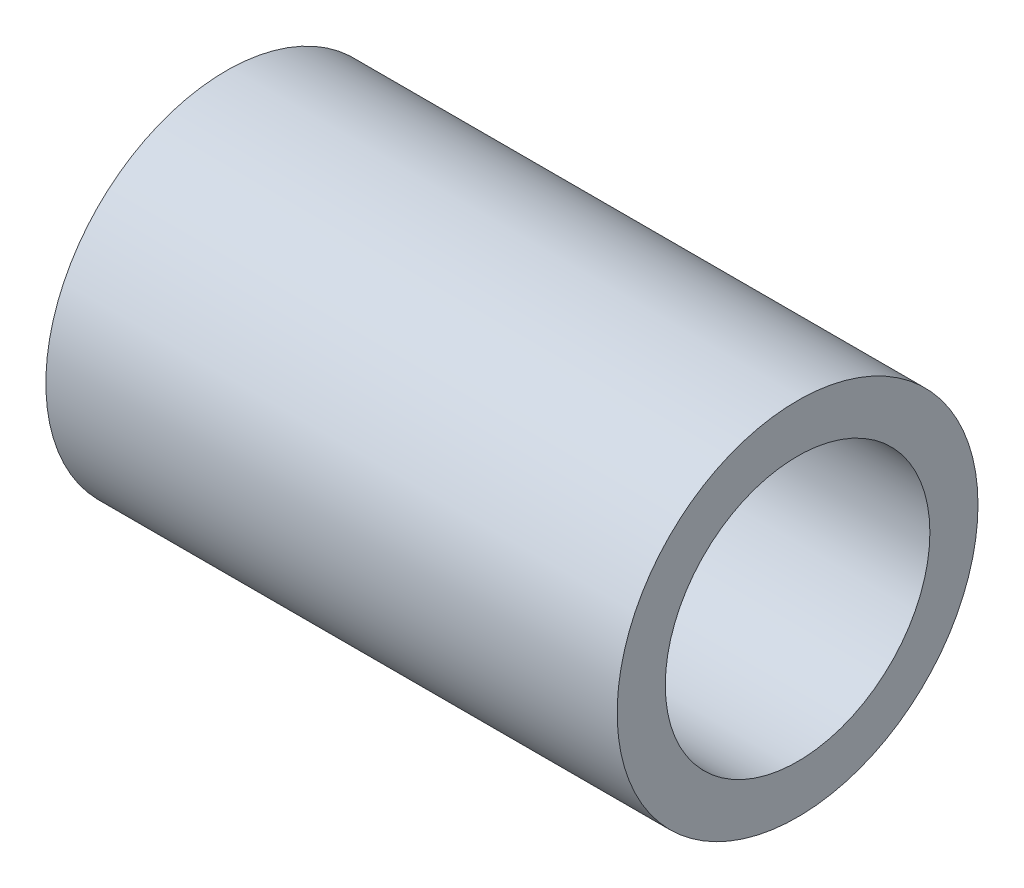
ISO-10303-21;
HEADER;
FILE_DESCRIPTION(('STEP AP214'),'2;1');
FILE_NAME('part.step','',(''),(''),'','','');
FILE_SCHEMA(('AUTOMOTIVE_DESIGN { 1 0 10303 214 1 1 1 1 }'));
ENDSEC;
DATA;
#1=APPLICATION_CONTEXT('core data for automotive mechanical design processes');
#2=APPLICATION_PROTOCOL_DEFINITION('international standard','automotive_design',2000,#1);
#3=PRODUCT_CONTEXT('',#1,'mechanical');
#4=PRODUCT('Part','Part','',(#3));
#5=PRODUCT_RELATED_PRODUCT_CATEGORY('part','',(#4));
#6=PRODUCT_DEFINITION_FORMATION('','',#4);
#7=PRODUCT_DEFINITION_CONTEXT('part definition',#1,'design');
#8=PRODUCT_DEFINITION('design','',#6,#7);
#9=PRODUCT_DEFINITION_SHAPE('','',#8);
#10=(LENGTH_UNIT() NAMED_UNIT(*) SI_UNIT(.MILLI.,.METRE.));
#11=(NAMED_UNIT(*) PLANE_ANGLE_UNIT() SI_UNIT($,.RADIAN.));
#12=(NAMED_UNIT(*) SI_UNIT($,.STERADIAN.) SOLID_ANGLE_UNIT());
#13=UNCERTAINTY_MEASURE_WITH_UNIT(LENGTH_MEASURE(1.E-05),#10,'distance_accuracy_value','');
#14=(GEOMETRIC_REPRESENTATION_CONTEXT(3) GLOBAL_UNCERTAINTY_ASSIGNED_CONTEXT((#13)) GLOBAL_UNIT_ASSIGNED_CONTEXT((#10,
#11,#12)) REPRESENTATION_CONTEXT('',''));
#15=CARTESIAN_POINT('',(0.,0.,0.));
#16=DIRECTION('',(0.,0.,1.));
#17=DIRECTION('',(1.,0.,0.));
#18=AXIS2_PLACEMENT_3D('',#15,#16,#17);
#19=CARTESIAN_POINT('',(9.5,27.3003641382373,38.7573514864184));
#20=DIRECTION('',(1.,0.,0.));
#21=DIRECTION('',(0.,0.,-1.));
#22=AXIS2_PLACEMENT_3D('',#19,#20,#21);
#23=PLANE('',#22);
#24=CARTESIAN_POINT('',(9.5,27.3003641382373,38.7573514864184));
#25=DIRECTION('',(1.,0.,0.));
#26=DIRECTION('',(0.,0.,-1.));
#27=AXIS2_PLACEMENT_3D('',#24,#25,#26);
#28=CIRCLE('',#27,3.);
#29=CARTESIAN_POINT('',(9.5,27.3003641382373,35.7573514864184));
#30=VERTEX_POINT('',#29);
#31=EDGE_CURVE('E10',#30,#30,#28,.T.);
#32=ORIENTED_EDGE('',*,*,#31,.T.);
#33=EDGE_LOOP('',(#32));
#34=FACE_BOUND('',#33,.T.);
#35=CARTESIAN_POINT('',(9.5,27.3003641382373,38.7573514864184));
#36=DIRECTION('',(1.,0.,0.));
#37=DIRECTION('',(0.,0.,-1.));
#38=AXIS2_PLACEMENT_3D('',#35,#36,#37);
#39=CIRCLE('',#38,2.2);
#40=CARTESIAN_POINT('',(9.5,27.3003641382373,36.5573514864184));
#41=VERTEX_POINT('',#40);
#42=EDGE_CURVE('E48',#41,#41,#39,.T.);
#43=ORIENTED_EDGE('',*,*,#42,.F.);
#44=EDGE_LOOP('',(#43));
#45=FACE_BOUND('',#44,.T.);
#46=ADVANCED_FACE('F37',(#34,#45),#23,.T.);
#47=CARTESIAN_POINT('',(0.,27.3003641382373,38.7573514864184));
#48=DIRECTION('',(1.,0.,0.));
#49=DIRECTION('',(0.,0.,-1.));
#50=AXIS2_PLACEMENT_3D('',#47,#48,#49);
#51=PLANE('',#50);
#52=CARTESIAN_POINT('',(0.,27.3003641382373,38.7573514864184));
#53=DIRECTION('',(1.,0.,0.));
#54=DIRECTION('',(0.,0.,-1.));
#55=AXIS2_PLACEMENT_3D('',#52,#53,#54);
#56=CIRCLE('',#55,3.);
#57=CARTESIAN_POINT('',(0.,27.3003641382373,35.7573514864184));
#58=VERTEX_POINT('',#57);
#59=EDGE_CURVE('E41',#58,#58,#56,.T.);
#60=ORIENTED_EDGE('',*,*,#59,.F.);
#61=EDGE_LOOP('',(#60));
#62=FACE_BOUND('',#61,.T.);
#63=CARTESIAN_POINT('',(0.,27.3003641382373,38.7573514864184));
#64=DIRECTION('',(1.,0.,0.));
#65=DIRECTION('',(0.,0.,-1.));
#66=AXIS2_PLACEMENT_3D('',#63,#64,#65);
#67=CIRCLE('',#66,2.2);
#68=CARTESIAN_POINT('',(0.,27.3003641382373,36.5573514864184));
#69=VERTEX_POINT('',#68);
#70=EDGE_CURVE('E50',#69,#69,#67,.T.);
#71=ORIENTED_EDGE('',*,*,#70,.T.);
#72=EDGE_LOOP('',(#71));
#73=FACE_BOUND('',#72,.T.);
#74=ADVANCED_FACE('F60',(#62,#73),#51,.F.);
#75=CARTESIAN_POINT('',(9.5,27.3003641382373,38.7573514864184));
#76=DIRECTION('',(-1.,0.,0.));
#77=DIRECTION('',(0.,0.,1.));
#78=AXIS2_PLACEMENT_3D('',#75,#76,#77);
#79=CYLINDRICAL_SURFACE('',#78,3.);
#80=ORIENTED_EDGE('',*,*,#31,.F.);
#81=EDGE_LOOP('',(#80));
#82=FACE_BOUND('',#81,.T.);
#83=ORIENTED_EDGE('',*,*,#59,.T.);
#84=EDGE_LOOP('',(#83));
#85=FACE_BOUND('',#84,.T.);
#86=ADVANCED_FACE('F39',(#82,#85),#79,.T.);
#87=CARTESIAN_POINT('',(9.5,27.3003641382373,38.7573514864184));
#88=DIRECTION('',(-1.,0.,0.));
#89=DIRECTION('',(0.,0.,1.));
#90=AXIS2_PLACEMENT_3D('',#87,#88,#89);
#91=CYLINDRICAL_SURFACE('',#90,2.2);
#92=ORIENTED_EDGE('',*,*,#42,.T.);
#93=EDGE_LOOP('',(#92));
#94=FACE_BOUND('',#93,.T.);
#95=ORIENTED_EDGE('',*,*,#70,.F.);
#96=EDGE_LOOP('',(#95));
#97=FACE_BOUND('',#96,.T.);
#98=ADVANCED_FACE('F56',(#94,#97),#91,.F.);
#99=CLOSED_SHELL('',(#46,#74,#86,#98));
#100=MANIFOLD_SOLID_BREP('B2',#99);
#101=ADVANCED_BREP_SHAPE_REPRESENTATION('',(#18,#100),#14);
#102=SHAPE_DEFINITION_REPRESENTATION(#9,#101);
ENDSEC;
END-ISO-10303-21;
